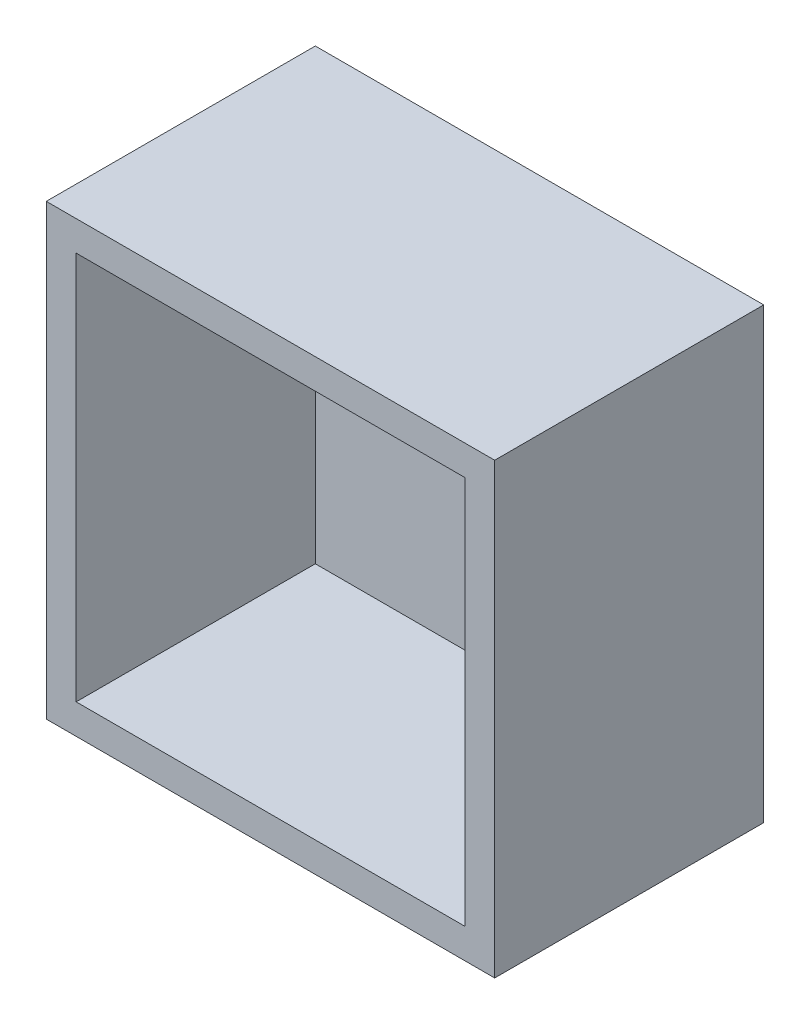
ISO-10303-21;
HEADER;
FILE_DESCRIPTION(('STEP AP214'),'2;1');
FILE_NAME('part.step','',(''),(''),'','','');
FILE_SCHEMA(('AUTOMOTIVE_DESIGN { 1 0 10303 214 1 1 1 1 }'));
ENDSEC;
DATA;
#1=APPLICATION_CONTEXT('core data for automotive mechanical design processes');
#2=APPLICATION_PROTOCOL_DEFINITION('international standard','automotive_design',2000,#1);
#3=PRODUCT_CONTEXT('',#1,'mechanical');
#4=PRODUCT('Part','Part','',(#3));
#5=PRODUCT_RELATED_PRODUCT_CATEGORY('part','',(#4));
#6=PRODUCT_DEFINITION_FORMATION('','',#4);
#7=PRODUCT_DEFINITION_CONTEXT('part definition',#1,'design');
#8=PRODUCT_DEFINITION('design','',#6,#7);
#9=PRODUCT_DEFINITION_SHAPE('','',#8);
#10=(LENGTH_UNIT() NAMED_UNIT(*) SI_UNIT(.MILLI.,.METRE.));
#11=(NAMED_UNIT(*) PLANE_ANGLE_UNIT() SI_UNIT($,.RADIAN.));
#12=(NAMED_UNIT(*) SI_UNIT($,.STERADIAN.) SOLID_ANGLE_UNIT());
#13=UNCERTAINTY_MEASURE_WITH_UNIT(LENGTH_MEASURE(1.E-05),#10,'distance_accuracy_value','');
#14=(GEOMETRIC_REPRESENTATION_CONTEXT(3) GLOBAL_UNCERTAINTY_ASSIGNED_CONTEXT((#13)) GLOBAL_UNIT_ASSIGNED_CONTEXT((#10,
#11,#12)) REPRESENTATION_CONTEXT('',''));
#15=CARTESIAN_POINT('',(0.,0.,0.));
#16=DIRECTION('',(0.,0.,1.));
#17=DIRECTION('',(1.,0.,0.));
#18=AXIS2_PLACEMENT_3D('',#15,#16,#17);
#19=CARTESIAN_POINT('',(0.,0.,45.));
#20=DIRECTION('',(0.,0.,-1.));
#21=DIRECTION('',(-1.,0.,0.));
#22=AXIS2_PLACEMENT_3D('',#19,#20,#21);
#23=PLANE('',#22);
#24=DIRECTION('',(0.,1.,0.));
#25=VECTOR('',#24,1.);
#26=CARTESIAN_POINT('',(37.5,-37.5,45.));
#27=LINE('',#26,#25);
#28=CARTESIAN_POINT('',(37.5,-37.5,45.));
#29=VERTEX_POINT('',#28);
#30=CARTESIAN_POINT('',(37.5,37.5,45.));
#31=VERTEX_POINT('',#30);
#32=EDGE_CURVE('E144',#29,#31,#27,.T.);
#33=ORIENTED_EDGE('',*,*,#32,.T.);
#34=DIRECTION('',(-1.,0.,0.));
#35=VECTOR('',#34,1.);
#36=CARTESIAN_POINT('',(-37.5,37.5,45.));
#37=LINE('',#36,#35);
#38=CARTESIAN_POINT('',(-37.5,37.5,45.));
#39=VERTEX_POINT('',#38);
#40=EDGE_CURVE('E88',#31,#39,#37,.T.);
#41=ORIENTED_EDGE('',*,*,#40,.T.);
#42=DIRECTION('',(0.,-1.,0.));
#43=VECTOR('',#42,1.);
#44=CARTESIAN_POINT('',(-37.5,-37.5,45.));
#45=LINE('',#44,#43);
#46=CARTESIAN_POINT('',(-37.5,-37.5,45.));
#47=VERTEX_POINT('',#46);
#48=EDGE_CURVE('E147',#39,#47,#45,.T.);
#49=ORIENTED_EDGE('',*,*,#48,.T.);
#50=DIRECTION('',(1.,0.,0.));
#51=VECTOR('',#50,1.);
#52=CARTESIAN_POINT('',(-37.5,-37.5,45.));
#53=LINE('',#52,#51);
#54=EDGE_CURVE('E60',#47,#29,#53,.T.);
#55=ORIENTED_EDGE('',*,*,#54,.T.);
#56=EDGE_LOOP('',(#33,#41,#49,#55));
#57=FACE_BOUND('',#56,.T.);
#58=DIRECTION('',(0.,1.,0.));
#59=VECTOR('',#58,1.);
#60=CARTESIAN_POINT('',(32.5,0.,45.));
#61=LINE('',#60,#59);
#62=CARTESIAN_POINT('',(32.5,-32.5,45.));
#63=VERTEX_POINT('',#62);
#64=CARTESIAN_POINT('',(32.5,32.5,45.));
#65=VERTEX_POINT('',#64);
#66=EDGE_CURVE('E133',#63,#65,#61,.T.);
#67=ORIENTED_EDGE('',*,*,#66,.F.);
#68=DIRECTION('',(1.,0.,0.));
#69=VECTOR('',#68,1.);
#70=CARTESIAN_POINT('',(0.,-32.5,45.));
#71=LINE('',#70,#69);
#72=CARTESIAN_POINT('',(-32.5,-32.5,45.));
#73=VERTEX_POINT('',#72);
#74=EDGE_CURVE('E142',#73,#63,#71,.T.);
#75=ORIENTED_EDGE('',*,*,#74,.F.);
#76=DIRECTION('',(0.,-1.,0.));
#77=VECTOR('',#76,1.);
#78=CARTESIAN_POINT('',(-32.5,0.,45.));
#79=LINE('',#78,#77);
#80=CARTESIAN_POINT('',(-32.5,32.5,45.));
#81=VERTEX_POINT('',#80);
#82=EDGE_CURVE('E140',#81,#73,#79,.T.);
#83=ORIENTED_EDGE('',*,*,#82,.F.);
#84=DIRECTION('',(-1.,0.,0.));
#85=VECTOR('',#84,1.);
#86=CARTESIAN_POINT('',(0.,32.5,45.));
#87=LINE('',#86,#85);
#88=EDGE_CURVE('E125',#65,#81,#87,.T.);
#89=ORIENTED_EDGE('',*,*,#88,.F.);
#90=EDGE_LOOP('',(#67,#75,#83,#89));
#91=FACE_BOUND('',#90,.T.);
#92=ADVANCED_FACE('F36',(#57,#91),#23,.F.);
#93=CARTESIAN_POINT('',(37.5,-37.5,45.));
#94=DIRECTION('',(-1.,0.,0.));
#95=DIRECTION('',(0.,0.,1.));
#96=AXIS2_PLACEMENT_3D('',#93,#94,#95);
#97=PLANE('',#96);
#98=DIRECTION('',(0.,1.,0.));
#99=VECTOR('',#98,1.);
#100=CARTESIAN_POINT('',(37.5,-37.5,0.));
#101=LINE('',#100,#99);
#102=CARTESIAN_POINT('',(37.5,-37.5,0.));
#103=VERTEX_POINT('',#102);
#104=CARTESIAN_POINT('',(37.5,37.5,0.));
#105=VERTEX_POINT('',#104);
#106=EDGE_CURVE('E151',#103,#105,#101,.T.);
#107=ORIENTED_EDGE('',*,*,#106,.T.);
#108=DIRECTION('',(0.,0.,-1.));
#109=VECTOR('',#108,1.);
#110=CARTESIAN_POINT('',(37.5,37.5,45.));
#111=LINE('',#110,#109);
#112=EDGE_CURVE('E11',#31,#105,#111,.T.);
#113=ORIENTED_EDGE('',*,*,#112,.F.);
#114=ORIENTED_EDGE('',*,*,#32,.F.);
#115=DIRECTION('',(0.,0.,-1.));
#116=VECTOR('',#115,1.);
#117=CARTESIAN_POINT('',(37.5,-37.5,45.));
#118=LINE('',#117,#116);
#119=EDGE_CURVE('E150',#29,#103,#118,.T.);
#120=ORIENTED_EDGE('',*,*,#119,.T.);
#121=EDGE_LOOP('',(#107,#113,#114,#120));
#122=FACE_BOUND('',#121,.T.);
#123=ADVANCED_FACE('F38',(#122),#97,.F.);
#124=CARTESIAN_POINT('',(-37.5,37.5,45.));
#125=DIRECTION('',(0.,-1.,0.));
#126=DIRECTION('',(0.,0.,-1.));
#127=AXIS2_PLACEMENT_3D('',#124,#125,#126);
#128=PLANE('',#127);
#129=DIRECTION('',(-1.,0.,0.));
#130=VECTOR('',#129,1.);
#131=CARTESIAN_POINT('',(-37.5,37.5,0.));
#132=LINE('',#131,#130);
#133=CARTESIAN_POINT('',(-37.5,37.5,0.));
#134=VERTEX_POINT('',#133);
#135=EDGE_CURVE('E154',#105,#134,#132,.T.);
#136=ORIENTED_EDGE('',*,*,#135,.T.);
#137=DIRECTION('',(0.,0.,-1.));
#138=VECTOR('',#137,1.);
#139=CARTESIAN_POINT('',(-37.5,37.5,45.));
#140=LINE('',#139,#138);
#141=EDGE_CURVE('E44',#39,#134,#140,.T.);
#142=ORIENTED_EDGE('',*,*,#141,.F.);
#143=ORIENTED_EDGE('',*,*,#40,.F.);
#144=ORIENTED_EDGE('',*,*,#112,.T.);
#145=EDGE_LOOP('',(#136,#142,#143,#144));
#146=FACE_BOUND('',#145,.T.);
#147=ADVANCED_FACE('F182',(#146),#128,.F.);
#148=CARTESIAN_POINT('',(-37.5,-37.5,45.));
#149=DIRECTION('',(1.,0.,0.));
#150=DIRECTION('',(0.,0.,-1.));
#151=AXIS2_PLACEMENT_3D('',#148,#149,#150);
#152=PLANE('',#151);
#153=DIRECTION('',(0.,-1.,0.));
#154=VECTOR('',#153,1.);
#155=CARTESIAN_POINT('',(-37.5,-37.5,0.));
#156=LINE('',#155,#154);
#157=CARTESIAN_POINT('',(-37.5,-37.5,0.));
#158=VERTEX_POINT('',#157);
#159=EDGE_CURVE('E156',#134,#158,#156,.T.);
#160=ORIENTED_EDGE('',*,*,#159,.T.);
#161=DIRECTION('',(0.,0.,-1.));
#162=VECTOR('',#161,1.);
#163=CARTESIAN_POINT('',(-37.5,-37.5,45.));
#164=LINE('',#163,#162);
#165=EDGE_CURVE('E160',#47,#158,#164,.T.);
#166=ORIENTED_EDGE('',*,*,#165,.F.);
#167=ORIENTED_EDGE('',*,*,#48,.F.);
#168=ORIENTED_EDGE('',*,*,#141,.T.);
#169=EDGE_LOOP('',(#160,#166,#167,#168));
#170=FACE_BOUND('',#169,.T.);
#171=ADVANCED_FACE('F165',(#170),#152,.F.);
#172=CARTESIAN_POINT('',(-37.5,-37.5,45.));
#173=DIRECTION('',(0.,1.,0.));
#174=DIRECTION('',(0.,0.,1.));
#175=AXIS2_PLACEMENT_3D('',#172,#173,#174);
#176=PLANE('',#175);
#177=DIRECTION('',(1.,0.,0.));
#178=VECTOR('',#177,1.);
#179=CARTESIAN_POINT('',(-37.5,-37.5,0.));
#180=LINE('',#179,#178);
#181=EDGE_CURVE('E81',#158,#103,#180,.T.);
#182=ORIENTED_EDGE('',*,*,#181,.T.);
#183=ORIENTED_EDGE('',*,*,#119,.F.);
#184=ORIENTED_EDGE('',*,*,#54,.F.);
#185=ORIENTED_EDGE('',*,*,#165,.T.);
#186=EDGE_LOOP('',(#182,#183,#184,#185));
#187=FACE_BOUND('',#186,.T.);
#188=ADVANCED_FACE('F173',(#187),#176,.F.);
#189=CARTESIAN_POINT('',(0.,0.,0.));
#190=DIRECTION('',(0.,0.,-1.));
#191=DIRECTION('',(-1.,0.,0.));
#192=AXIS2_PLACEMENT_3D('',#189,#190,#191);
#193=PLANE('',#192);
#194=ORIENTED_EDGE('',*,*,#106,.F.);
#195=ORIENTED_EDGE('',*,*,#181,.F.);
#196=ORIENTED_EDGE('',*,*,#159,.F.);
#197=ORIENTED_EDGE('',*,*,#135,.F.);
#198=EDGE_LOOP('',(#194,#195,#196,#197));
#199=FACE_BOUND('',#198,.T.);
#200=ADVANCED_FACE('F169',(#199),#193,.T.);
#201=CARTESIAN_POINT('',(32.5,-37.5,45.));
#202=DIRECTION('',(-1.,0.,0.));
#203=DIRECTION('',(0.,0.,1.));
#204=AXIS2_PLACEMENT_3D('',#201,#202,#203);
#205=PLANE('',#204);
#206=DIRECTION('',(0.,1.,0.));
#207=VECTOR('',#206,1.);
#208=CARTESIAN_POINT('',(32.5,0.,5.));
#209=LINE('',#208,#207);
#210=CARTESIAN_POINT('',(32.5,-32.5,5.));
#211=VERTEX_POINT('',#210);
#212=CARTESIAN_POINT('',(32.5,32.5,5.));
#213=VERTEX_POINT('',#212);
#214=EDGE_CURVE('E116',#211,#213,#209,.T.);
#215=ORIENTED_EDGE('',*,*,#214,.F.);
#216=DIRECTION('',(0.,0.,-1.));
#217=VECTOR('',#216,1.);
#218=CARTESIAN_POINT('',(32.5,-32.5,45.));
#219=LINE('',#218,#217);
#220=EDGE_CURVE('E136',#63,#211,#219,.T.);
#221=ORIENTED_EDGE('',*,*,#220,.F.);
#222=ORIENTED_EDGE('',*,*,#66,.T.);
#223=DIRECTION('',(0.,0.,-1.));
#224=VECTOR('',#223,1.);
#225=CARTESIAN_POINT('',(32.5,32.5,45.));
#226=LINE('',#225,#224);
#227=EDGE_CURVE('E128',#65,#213,#226,.T.);
#228=ORIENTED_EDGE('',*,*,#227,.T.);
#229=EDGE_LOOP('',(#215,#221,#222,#228));
#230=FACE_BOUND('',#229,.T.);
#231=ADVANCED_FACE('F180',(#230),#205,.T.);
#232=CARTESIAN_POINT('',(-37.5,32.5,45.));
#233=DIRECTION('',(0.,-1.,0.));
#234=DIRECTION('',(0.,0.,-1.));
#235=AXIS2_PLACEMENT_3D('',#232,#233,#234);
#236=PLANE('',#235);
#237=DIRECTION('',(-1.,0.,0.));
#238=VECTOR('',#237,1.);
#239=CARTESIAN_POINT('',(0.,32.5,5.));
#240=LINE('',#239,#238);
#241=CARTESIAN_POINT('',(-32.5,32.5,5.));
#242=VERTEX_POINT('',#241);
#243=EDGE_CURVE('E110',#213,#242,#240,.T.);
#244=ORIENTED_EDGE('',*,*,#243,.F.);
#245=ORIENTED_EDGE('',*,*,#227,.F.);
#246=ORIENTED_EDGE('',*,*,#88,.T.);
#247=DIRECTION('',(0.,0.,-1.));
#248=VECTOR('',#247,1.);
#249=CARTESIAN_POINT('',(-32.5,32.5,45.));
#250=LINE('',#249,#248);
#251=EDGE_CURVE('E122',#81,#242,#250,.T.);
#252=ORIENTED_EDGE('',*,*,#251,.T.);
#253=EDGE_LOOP('',(#244,#245,#246,#252));
#254=FACE_BOUND('',#253,.T.);
#255=ADVANCED_FACE('F123',(#254),#236,.T.);
#256=CARTESIAN_POINT('',(-32.5,-37.5,45.));
#257=DIRECTION('',(1.,0.,0.));
#258=DIRECTION('',(0.,0.,-1.));
#259=AXIS2_PLACEMENT_3D('',#256,#257,#258);
#260=PLANE('',#259);
#261=DIRECTION('',(0.,-1.,0.));
#262=VECTOR('',#261,1.);
#263=CARTESIAN_POINT('',(-32.5,0.,5.));
#264=LINE('',#263,#262);
#265=CARTESIAN_POINT('',(-32.5,-32.5,5.));
#266=VERTEX_POINT('',#265);
#267=EDGE_CURVE('E114',#242,#266,#264,.T.);
#268=ORIENTED_EDGE('',*,*,#267,.F.);
#269=ORIENTED_EDGE('',*,*,#251,.F.);
#270=ORIENTED_EDGE('',*,*,#82,.T.);
#271=DIRECTION('',(0.,0.,-1.));
#272=VECTOR('',#271,1.);
#273=CARTESIAN_POINT('',(-32.5,-32.5,45.));
#274=LINE('',#273,#272);
#275=EDGE_CURVE('E51',#73,#266,#274,.T.);
#276=ORIENTED_EDGE('',*,*,#275,.T.);
#277=EDGE_LOOP('',(#268,#269,#270,#276));
#278=FACE_BOUND('',#277,.T.);
#279=ADVANCED_FACE('F130',(#278),#260,.T.);
#280=CARTESIAN_POINT('',(-37.5,-32.5,45.));
#281=DIRECTION('',(0.,1.,0.));
#282=DIRECTION('',(0.,0.,1.));
#283=AXIS2_PLACEMENT_3D('',#280,#281,#282);
#284=PLANE('',#283);
#285=DIRECTION('',(1.,0.,0.));
#286=VECTOR('',#285,1.);
#287=CARTESIAN_POINT('',(0.,-32.5,5.));
#288=LINE('',#287,#286);
#289=EDGE_CURVE('E131',#266,#211,#288,.T.);
#290=ORIENTED_EDGE('',*,*,#289,.F.);
#291=ORIENTED_EDGE('',*,*,#275,.F.);
#292=ORIENTED_EDGE('',*,*,#74,.T.);
#293=ORIENTED_EDGE('',*,*,#220,.T.);
#294=EDGE_LOOP('',(#290,#291,#292,#293));
#295=FACE_BOUND('',#294,.T.);
#296=ADVANCED_FACE('F193',(#295),#284,.T.);
#297=CARTESIAN_POINT('',(0.,0.,5.));
#298=DIRECTION('',(0.,0.,-1.));
#299=DIRECTION('',(-1.,0.,0.));
#300=AXIS2_PLACEMENT_3D('',#297,#298,#299);
#301=PLANE('',#300);
#302=ORIENTED_EDGE('',*,*,#214,.T.);
#303=ORIENTED_EDGE('',*,*,#243,.T.);
#304=ORIENTED_EDGE('',*,*,#267,.T.);
#305=ORIENTED_EDGE('',*,*,#289,.T.);
#306=EDGE_LOOP('',(#302,#303,#304,#305));
#307=FACE_BOUND('',#306,.T.);
#308=ADVANCED_FACE('F112',(#307),#301,.F.);
#309=CLOSED_SHELL('',(#92,#123,#147,#171,#188,#200,#231,#255,#279,#296,#308));
#310=MANIFOLD_SOLID_BREP('B2',#309);
#311=ADVANCED_BREP_SHAPE_REPRESENTATION('',(#18,#310),#14);
#312=SHAPE_DEFINITION_REPRESENTATION(#9,#311);
ENDSEC;
END-ISO-10303-21;
